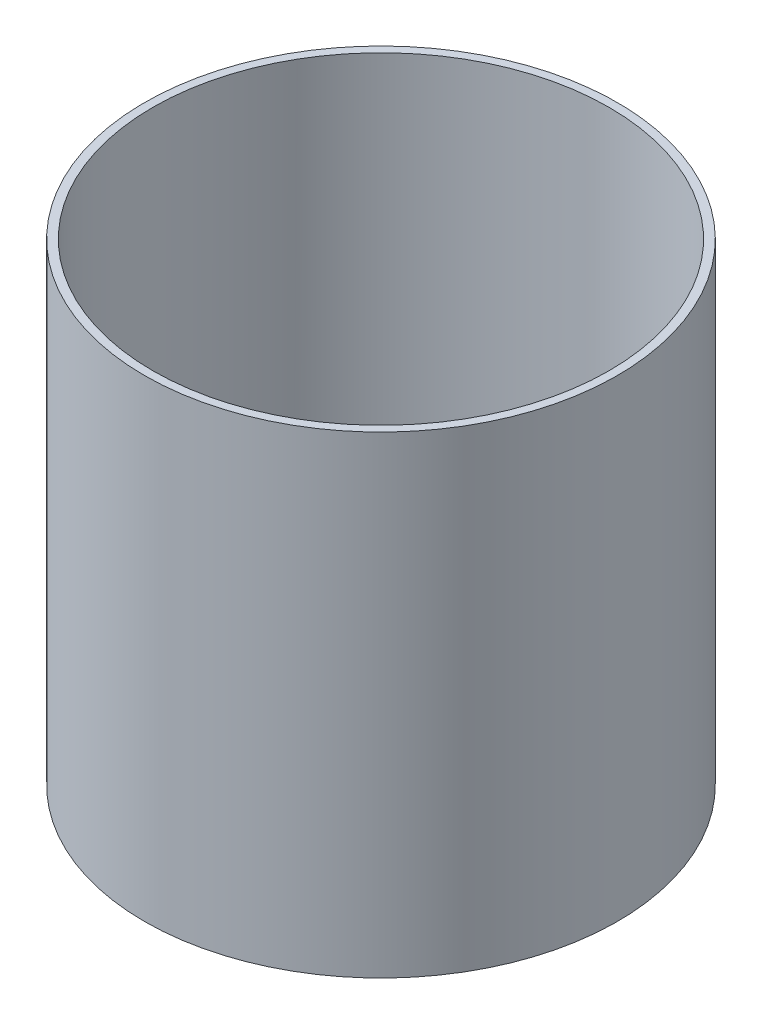
ISO-10303-21;
HEADER;
FILE_DESCRIPTION(('STEP AP214'),'2;1');
FILE_NAME('part.step','',(''),(''),'','','');
FILE_SCHEMA(('AUTOMOTIVE_DESIGN { 1 0 10303 214 1 1 1 1 }'));
ENDSEC;
DATA;
#1=APPLICATION_CONTEXT('core data for automotive mechanical design processes');
#2=APPLICATION_PROTOCOL_DEFINITION('international standard','automotive_design',2000,#1);
#3=PRODUCT_CONTEXT('',#1,'mechanical');
#4=PRODUCT('Part','Part','',(#3));
#5=PRODUCT_RELATED_PRODUCT_CATEGORY('part','',(#4));
#6=PRODUCT_DEFINITION_FORMATION('','',#4);
#7=PRODUCT_DEFINITION_CONTEXT('part definition',#1,'design');
#8=PRODUCT_DEFINITION('design','',#6,#7);
#9=PRODUCT_DEFINITION_SHAPE('','',#8);
#10=(LENGTH_UNIT() NAMED_UNIT(*) SI_UNIT(.MILLI.,.METRE.));
#11=(NAMED_UNIT(*) PLANE_ANGLE_UNIT() SI_UNIT($,.RADIAN.));
#12=(NAMED_UNIT(*) SI_UNIT($,.STERADIAN.) SOLID_ANGLE_UNIT());
#13=UNCERTAINTY_MEASURE_WITH_UNIT(LENGTH_MEASURE(1.E-05),#10,'distance_accuracy_value','');
#14=(GEOMETRIC_REPRESENTATION_CONTEXT(3) GLOBAL_UNCERTAINTY_ASSIGNED_CONTEXT((#13)) GLOBAL_UNIT_ASSIGNED_CONTEXT((#10,
#11,#12)) REPRESENTATION_CONTEXT('',''));
#15=CARTESIAN_POINT('',(0.,0.,0.));
#16=DIRECTION('',(0.,0.,1.));
#17=DIRECTION('',(1.,0.,0.));
#18=AXIS2_PLACEMENT_3D('',#15,#16,#17);
#19=CARTESIAN_POINT('',(0.,100.,0.));
#20=DIRECTION('',(0.,-1.,0.));
#21=DIRECTION('',(0.,0.,-1.));
#22=AXIS2_PLACEMENT_3D('',#19,#20,#21);
#23=CYLINDRICAL_SURFACE('',#22,48.25);
#24=CARTESIAN_POINT('',(0.,100.,0.));
#25=DIRECTION('',(0.,1.,0.));
#26=DIRECTION('',(0.,0.,1.));
#27=AXIS2_PLACEMENT_3D('',#24,#25,#26);
#28=CIRCLE('',#27,48.25);
#29=CARTESIAN_POINT('',(0.,100.,48.25));
#30=VERTEX_POINT('',#29);
#31=EDGE_CURVE('E47',#30,#30,#28,.T.);
#32=ORIENTED_EDGE('',*,*,#31,.T.);
#33=EDGE_LOOP('',(#32));
#34=FACE_BOUND('',#33,.T.);
#35=CARTESIAN_POINT('',(0.,1.5,0.));
#36=DIRECTION('',(0.,-1.,0.));
#37=DIRECTION('',(0.,0.,-1.));
#38=AXIS2_PLACEMENT_3D('',#35,#36,#37);
#39=CIRCLE('',#38,48.25);
#40=CARTESIAN_POINT('',(0.,1.5,-48.25));
#41=VERTEX_POINT('',#40);
#42=EDGE_CURVE('E52',#41,#41,#39,.T.);
#43=ORIENTED_EDGE('',*,*,#42,.T.);
#44=EDGE_LOOP('',(#43));
#45=FACE_BOUND('',#44,.T.);
#46=ADVANCED_FACE('F34',(#34,#45),#23,.F.);
#47=CARTESIAN_POINT('',(0.,100.,0.));
#48=DIRECTION('',(0.,1.,0.));
#49=DIRECTION('',(0.,0.,1.));
#50=AXIS2_PLACEMENT_3D('',#47,#48,#49);
#51=PLANE('',#50);
#52=CARTESIAN_POINT('',(0.,100.,0.));
#53=DIRECTION('',(0.,1.,0.));
#54=DIRECTION('',(0.,0.,1.));
#55=AXIS2_PLACEMENT_3D('',#52,#53,#54);
#56=CIRCLE('',#55,50.);
#57=CARTESIAN_POINT('',(0.,100.,50.));
#58=VERTEX_POINT('',#57);
#59=EDGE_CURVE('E10',#58,#58,#56,.T.);
#60=ORIENTED_EDGE('',*,*,#59,.T.);
#61=EDGE_LOOP('',(#60));
#62=FACE_BOUND('',#61,.T.);
#63=ORIENTED_EDGE('',*,*,#31,.F.);
#64=EDGE_LOOP('',(#63));
#65=FACE_BOUND('',#64,.T.);
#66=ADVANCED_FACE('F74',(#62,#65),#51,.T.);
#67=CARTESIAN_POINT('',(0.,0.,0.));
#68=DIRECTION('',(0.,1.,0.));
#69=DIRECTION('',(0.,0.,1.));
#70=AXIS2_PLACEMENT_3D('',#67,#68,#69);
#71=PLANE('',#70);
#72=CARTESIAN_POINT('',(20.,0.,0.));
#73=DIRECTION('',(0.,-1.,0.));
#74=DIRECTION('',(0.,0.,-1.));
#75=AXIS2_PLACEMENT_3D('',#72,#73,#74);
#76=CIRCLE('',#75,7.25);
#77=CARTESIAN_POINT('',(20.,0.,-7.25));
#78=VERTEX_POINT('',#77);
#79=EDGE_CURVE('E56',#78,#78,#76,.T.);
#80=ORIENTED_EDGE('',*,*,#79,.F.);
#81=EDGE_LOOP('',(#80));
#82=FACE_BOUND('',#81,.T.);
#83=CARTESIAN_POINT('',(-20.,0.,0.));
#84=DIRECTION('',(0.,-1.,0.));
#85=DIRECTION('',(0.,0.,-1.));
#86=AXIS2_PLACEMENT_3D('',#83,#84,#85);
#87=CIRCLE('',#86,7.25);
#88=CARTESIAN_POINT('',(-20.,0.,-7.25));
#89=VERTEX_POINT('',#88);
#90=EDGE_CURVE('E61',#89,#89,#87,.T.);
#91=ORIENTED_EDGE('',*,*,#90,.F.);
#92=EDGE_LOOP('',(#91));
#93=FACE_BOUND('',#92,.T.);
#94=CARTESIAN_POINT('',(0.,0.,0.));
#95=DIRECTION('',(0.,1.,0.));
#96=DIRECTION('',(0.,0.,1.));
#97=AXIS2_PLACEMENT_3D('',#94,#95,#96);
#98=CIRCLE('',#97,50.);
#99=CARTESIAN_POINT('',(0.,0.,50.));
#100=VERTEX_POINT('',#99);
#101=EDGE_CURVE('E42',#100,#100,#98,.T.);
#102=ORIENTED_EDGE('',*,*,#101,.F.);
#103=EDGE_LOOP('',(#102));
#104=FACE_BOUND('',#103,.T.);
#105=ADVANCED_FACE('F71',(#82,#93,#104),#71,.F.);
#106=CARTESIAN_POINT('',(0.,100.,0.));
#107=DIRECTION('',(0.,-1.,0.));
#108=DIRECTION('',(0.,0.,-1.));
#109=AXIS2_PLACEMENT_3D('',#106,#107,#108);
#110=CYLINDRICAL_SURFACE('',#109,50.);
#111=ORIENTED_EDGE('',*,*,#101,.T.);
#112=EDGE_LOOP('',(#111));
#113=FACE_BOUND('',#112,.T.);
#114=ORIENTED_EDGE('',*,*,#59,.F.);
#115=EDGE_LOOP('',(#114));
#116=FACE_BOUND('',#115,.T.);
#117=ADVANCED_FACE('F36',(#113,#116),#110,.T.);
#118=CARTESIAN_POINT('',(0.,1.5,0.));
#119=DIRECTION('',(0.,-1.,0.));
#120=DIRECTION('',(0.,0.,-1.));
#121=AXIS2_PLACEMENT_3D('',#118,#119,#120);
#122=PLANE('',#121);
#123=CARTESIAN_POINT('',(20.,1.5,0.));
#124=DIRECTION('',(0.,-1.,0.));
#125=DIRECTION('',(0.,0.,-1.));
#126=AXIS2_PLACEMENT_3D('',#123,#124,#125);
#127=CIRCLE('',#126,7.25);
#128=CARTESIAN_POINT('',(20.,1.5,-7.25));
#129=VERTEX_POINT('',#128);
#130=EDGE_CURVE('E38',#129,#129,#127,.T.);
#131=ORIENTED_EDGE('',*,*,#130,.T.);
#132=EDGE_LOOP('',(#131));
#133=FACE_BOUND('',#132,.T.);
#134=CARTESIAN_POINT('',(-20.,1.5,0.));
#135=DIRECTION('',(0.,-1.,0.));
#136=DIRECTION('',(0.,0.,-1.));
#137=AXIS2_PLACEMENT_3D('',#134,#135,#136);
#138=CIRCLE('',#137,7.25);
#139=CARTESIAN_POINT('',(-20.,1.5,-7.25));
#140=VERTEX_POINT('',#139);
#141=EDGE_CURVE('E54',#140,#140,#138,.T.);
#142=ORIENTED_EDGE('',*,*,#141,.T.);
#143=EDGE_LOOP('',(#142));
#144=FACE_BOUND('',#143,.T.);
#145=ORIENTED_EDGE('',*,*,#42,.F.);
#146=EDGE_LOOP('',(#145));
#147=FACE_BOUND('',#146,.T.);
#148=ADVANCED_FACE('F80',(#133,#144,#147),#122,.F.);
#149=CARTESIAN_POINT('',(-20.,2.5,0.));
#150=DIRECTION('',(0.,-1.,0.));
#151=DIRECTION('',(0.,0.,-1.));
#152=AXIS2_PLACEMENT_3D('',#149,#150,#151);
#153=CYLINDRICAL_SURFACE('',#152,7.25);
#154=ORIENTED_EDGE('',*,*,#90,.T.);
#155=EDGE_LOOP('',(#154));
#156=FACE_BOUND('',#155,.T.);
#157=ORIENTED_EDGE('',*,*,#141,.F.);
#158=EDGE_LOOP('',(#157));
#159=FACE_BOUND('',#158,.T.);
#160=ADVANCED_FACE('F68',(#156,#159),#153,.F.);
#161=CARTESIAN_POINT('',(20.,2.5,0.));
#162=DIRECTION('',(0.,-1.,0.));
#163=DIRECTION('',(0.,0.,-1.));
#164=AXIS2_PLACEMENT_3D('',#161,#162,#163);
#165=CYLINDRICAL_SURFACE('',#164,7.25);
#166=ORIENTED_EDGE('',*,*,#79,.T.);
#167=EDGE_LOOP('',(#166));
#168=FACE_BOUND('',#167,.T.);
#169=ORIENTED_EDGE('',*,*,#130,.F.);
#170=EDGE_LOOP('',(#169));
#171=FACE_BOUND('',#170,.T.);
#172=ADVANCED_FACE('F98',(#168,#171),#165,.F.);
#173=CLOSED_SHELL('',(#46,#66,#105,#117,#148,#160,#172));
#174=MANIFOLD_SOLID_BREP('B2',#173);
#175=ADVANCED_BREP_SHAPE_REPRESENTATION('',(#18,#174),#14);
#176=SHAPE_DEFINITION_REPRESENTATION(#9,#175);
ENDSEC;
END-ISO-10303-21;
